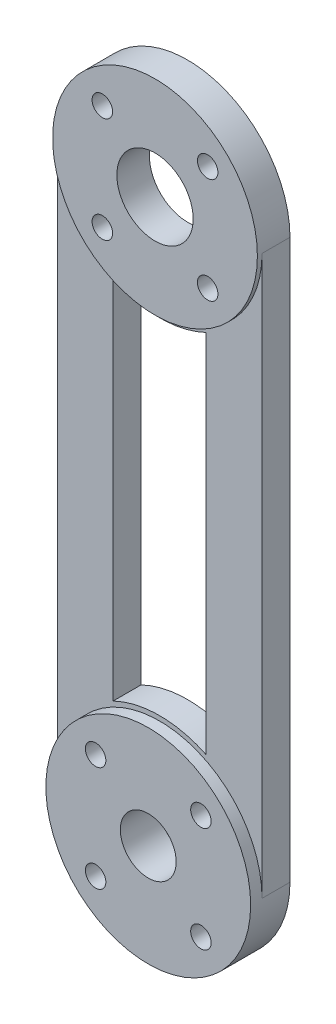
ISO-10303-21;
HEADER;
FILE_DESCRIPTION(('STEP AP214'),'2;1');
FILE_NAME('part.step','',(''),(''),'','','');
FILE_SCHEMA(('AUTOMOTIVE_DESIGN { 1 0 10303 214 1 1 1 1 }'));
ENDSEC;
DATA;
#1=APPLICATION_CONTEXT('core data for automotive mechanical design processes');
#2=APPLICATION_PROTOCOL_DEFINITION('international standard','automotive_design',2000,#1);
#3=PRODUCT_CONTEXT('',#1,'mechanical');
#4=PRODUCT('Part','Part','',(#3));
#5=PRODUCT_RELATED_PRODUCT_CATEGORY('part','',(#4));
#6=PRODUCT_DEFINITION_FORMATION('','',#4);
#7=PRODUCT_DEFINITION_CONTEXT('part definition',#1,'design');
#8=PRODUCT_DEFINITION('design','',#6,#7);
#9=PRODUCT_DEFINITION_SHAPE('','',#8);
#10=(LENGTH_UNIT() NAMED_UNIT(*) SI_UNIT(.MILLI.,.METRE.));
#11=(NAMED_UNIT(*) PLANE_ANGLE_UNIT() SI_UNIT($,.RADIAN.));
#12=(NAMED_UNIT(*) SI_UNIT($,.STERADIAN.) SOLID_ANGLE_UNIT());
#13=UNCERTAINTY_MEASURE_WITH_UNIT(LENGTH_MEASURE(1.E-05),#10,'distance_accuracy_value','');
#14=(GEOMETRIC_REPRESENTATION_CONTEXT(3) GLOBAL_UNCERTAINTY_ASSIGNED_CONTEXT((#13)) GLOBAL_UNIT_ASSIGNED_CONTEXT((#10,
#11,#12)) REPRESENTATION_CONTEXT('',''));
#15=CARTESIAN_POINT('',(0.,0.,0.));
#16=DIRECTION('',(0.,0.,1.));
#17=DIRECTION('',(1.,0.,0.));
#18=AXIS2_PLACEMENT_3D('',#15,#16,#17);
#19=CARTESIAN_POINT('',(-5.65685424949239,-35.6568542494924,9.71028137423857));
#20=DIRECTION('',(0.,0.,-1.));
#21=DIRECTION('',(1.,0.,0.));
#22=AXIS2_PLACEMENT_3D('',#19,#20,#21);
#23=CYLINDRICAL_SURFACE('',#22,1.1);
#24=CARTESIAN_POINT('',(-5.65685424949239,-35.6568542494924,1.225));
#25=DIRECTION('',(0.,0.,1.));
#26=DIRECTION('',(1.,0.,0.));
#27=AXIS2_PLACEMENT_3D('',#24,#25,#26);
#28=CIRCLE('',#27,1.1);
#29=CARTESIAN_POINT('',(-4.55685424949239,-35.6568542494924,1.225));
#30=VERTEX_POINT('',#29);
#31=EDGE_CURVE('E270',#30,#30,#28,.F.);
#32=ORIENTED_EDGE('',*,*,#31,.F.);
#33=EDGE_LOOP('',(#32));
#34=FACE_BOUND('',#33,.T.);
#35=CARTESIAN_POINT('',(-5.65685424949239,-35.6568542494924,-1.775));
#36=DIRECTION('',(0.,0.,1.));
#37=DIRECTION('',(1.,0.,0.));
#38=AXIS2_PLACEMENT_3D('',#35,#36,#37);
#39=CIRCLE('',#38,1.1);
#40=CARTESIAN_POINT('',(-4.55685424949239,-35.6568542494924,-1.775));
#41=VERTEX_POINT('',#40);
#42=EDGE_CURVE('E286',#41,#41,#39,.F.);
#43=ORIENTED_EDGE('',*,*,#42,.T.);
#44=EDGE_LOOP('',(#43));
#45=FACE_BOUND('',#44,.T.);
#46=ADVANCED_FACE('F37',(#34,#45),#23,.F.);
#47=CARTESIAN_POINT('',(-5.65685424949239,-24.3431457505076,9.71028137423857));
#48=DIRECTION('',(0.,0.,-1.));
#49=DIRECTION('',(1.,0.,0.));
#50=AXIS2_PLACEMENT_3D('',#47,#48,#49);
#51=CYLINDRICAL_SURFACE('',#50,1.1);
#52=CARTESIAN_POINT('',(-5.65685424949239,-24.3431457505076,1.225));
#53=DIRECTION('',(0.,0.,1.));
#54=DIRECTION('',(1.,0.,0.));
#55=AXIS2_PLACEMENT_3D('',#52,#53,#54);
#56=CIRCLE('',#55,1.1);
#57=CARTESIAN_POINT('',(-4.55685424949239,-24.3431457505076,1.225));
#58=VERTEX_POINT('',#57);
#59=EDGE_CURVE('E264',#58,#58,#56,.F.);
#60=ORIENTED_EDGE('',*,*,#59,.F.);
#61=EDGE_LOOP('',(#60));
#62=FACE_BOUND('',#61,.T.);
#63=CARTESIAN_POINT('',(-5.65685424949239,-24.3431457505076,-1.775));
#64=DIRECTION('',(0.,0.,1.));
#65=DIRECTION('',(1.,0.,0.));
#66=AXIS2_PLACEMENT_3D('',#63,#64,#65);
#67=CIRCLE('',#66,1.1);
#68=CARTESIAN_POINT('',(-4.55685424949239,-24.3431457505076,-1.775));
#69=VERTEX_POINT('',#68);
#70=EDGE_CURVE('E271',#69,#69,#67,.F.);
#71=ORIENTED_EDGE('',*,*,#70,.T.);
#72=EDGE_LOOP('',(#71));
#73=FACE_BOUND('',#72,.T.);
#74=ADVANCED_FACE('F354',(#62,#73),#51,.F.);
#75=CARTESIAN_POINT('',(5.65685424949243,-35.6568542494923,9.71028137423857));
#76=DIRECTION('',(0.,0.,-1.));
#77=DIRECTION('',(1.,0.,0.));
#78=AXIS2_PLACEMENT_3D('',#75,#76,#77);
#79=CYLINDRICAL_SURFACE('',#78,1.1);
#80=CARTESIAN_POINT('',(5.65685424949243,-35.6568542494923,1.225));
#81=DIRECTION('',(0.,0.,1.));
#82=DIRECTION('',(1.,0.,0.));
#83=AXIS2_PLACEMENT_3D('',#80,#81,#82);
#84=CIRCLE('',#83,1.1);
#85=CARTESIAN_POINT('',(6.75685424949243,-35.6568542494923,1.225));
#86=VERTEX_POINT('',#85);
#87=EDGE_CURVE('E267',#86,#86,#84,.F.);
#88=ORIENTED_EDGE('',*,*,#87,.F.);
#89=EDGE_LOOP('',(#88));
#90=FACE_BOUND('',#89,.T.);
#91=CARTESIAN_POINT('',(5.65685424949243,-35.6568542494923,-1.775));
#92=DIRECTION('',(0.,0.,1.));
#93=DIRECTION('',(1.,0.,0.));
#94=AXIS2_PLACEMENT_3D('',#91,#92,#93);
#95=CIRCLE('',#94,1.1);
#96=CARTESIAN_POINT('',(6.75685424949243,-35.6568542494923,-1.775));
#97=VERTEX_POINT('',#96);
#98=EDGE_CURVE('E276',#97,#97,#95,.F.);
#99=ORIENTED_EDGE('',*,*,#98,.T.);
#100=EDGE_LOOP('',(#99));
#101=FACE_BOUND('',#100,.T.);
#102=ADVANCED_FACE('F360',(#90,#101),#79,.F.);
#103=CARTESIAN_POINT('',(5.65685424949239,-24.3431457505076,9.71028137423857));
#104=DIRECTION('',(0.,0.,-1.));
#105=DIRECTION('',(1.,0.,0.));
#106=AXIS2_PLACEMENT_3D('',#103,#104,#105);
#107=CYLINDRICAL_SURFACE('',#106,1.1);
#108=CARTESIAN_POINT('',(5.65685424949239,-24.3431457505076,1.225));
#109=DIRECTION('',(0.,0.,1.));
#110=DIRECTION('',(1.,0.,0.));
#111=AXIS2_PLACEMENT_3D('',#108,#109,#110);
#112=CIRCLE('',#111,1.1);
#113=CARTESIAN_POINT('',(6.75685424949239,-24.3431457505076,1.225));
#114=VERTEX_POINT('',#113);
#115=EDGE_CURVE('E249',#114,#114,#112,.F.);
#116=ORIENTED_EDGE('',*,*,#115,.F.);
#117=EDGE_LOOP('',(#116));
#118=FACE_BOUND('',#117,.T.);
#119=CARTESIAN_POINT('',(5.65685424949239,-24.3431457505076,-1.775));
#120=DIRECTION('',(0.,0.,1.));
#121=DIRECTION('',(1.,0.,0.));
#122=AXIS2_PLACEMENT_3D('',#119,#120,#121);
#123=CIRCLE('',#122,1.1);
#124=CARTESIAN_POINT('',(6.75685424949239,-24.3431457505076,-1.775));
#125=VERTEX_POINT('',#124);
#126=EDGE_CURVE('E253',#125,#125,#123,.F.);
#127=ORIENTED_EDGE('',*,*,#126,.T.);
#128=EDGE_LOOP('',(#127));
#129=FACE_BOUND('',#128,.T.);
#130=ADVANCED_FACE('F371',(#118,#129),#107,.F.);
#131=CARTESIAN_POINT('',(-5.65685424949235,24.3431457505076,12.0965512114594));
#132=DIRECTION('',(0.,0.,-1.));
#133=DIRECTION('',(1.,0.,0.));
#134=AXIS2_PLACEMENT_3D('',#131,#132,#133);
#135=CYLINDRICAL_SURFACE('',#134,1.10000000000001);
#136=CARTESIAN_POINT('',(-5.65685424949235,24.3431457505076,0.5));
#137=DIRECTION('',(0.,0.,1.));
#138=DIRECTION('',(1.,0.,0.));
#139=AXIS2_PLACEMENT_3D('',#136,#137,#138);
#140=CIRCLE('',#139,1.10000000000001);
#141=CARTESIAN_POINT('',(-4.55685424949234,24.3431457505076,0.5));
#142=VERTEX_POINT('',#141);
#143=EDGE_CURVE('E215',#142,#142,#140,.F.);
#144=ORIENTED_EDGE('',*,*,#143,.F.);
#145=EDGE_LOOP('',(#144));
#146=FACE_BOUND('',#145,.T.);
#147=CARTESIAN_POINT('',(-5.65685424949235,24.3431457505076,-2.5));
#148=DIRECTION('',(0.,0.,1.));
#149=DIRECTION('',(1.,0.,0.));
#150=AXIS2_PLACEMENT_3D('',#147,#148,#149);
#151=CIRCLE('',#150,1.10000000000001);
#152=CARTESIAN_POINT('',(-4.55685424949234,24.3431457505076,-2.5));
#153=VERTEX_POINT('',#152);
#154=EDGE_CURVE('E224',#153,#153,#151,.F.);
#155=ORIENTED_EDGE('',*,*,#154,.T.);
#156=EDGE_LOOP('',(#155));
#157=FACE_BOUND('',#156,.T.);
#158=ADVANCED_FACE('F388',(#146,#157),#135,.F.);
#159=CARTESIAN_POINT('',(-5.65685424949243,35.6568542494923,12.0965512114594));
#160=DIRECTION('',(0.,0.,-1.));
#161=DIRECTION('',(1.,0.,0.));
#162=AXIS2_PLACEMENT_3D('',#159,#160,#161);
#163=CYLINDRICAL_SURFACE('',#162,1.10000000000001);
#164=CARTESIAN_POINT('',(-5.65685424949243,35.6568542494923,0.5));
#165=DIRECTION('',(0.,0.,1.));
#166=DIRECTION('',(1.,0.,0.));
#167=AXIS2_PLACEMENT_3D('',#164,#165,#166);
#168=CIRCLE('',#167,1.10000000000001);
#169=CARTESIAN_POINT('',(-4.55685424949242,35.6568542494923,0.5));
#170=VERTEX_POINT('',#169);
#171=EDGE_CURVE('E209',#170,#170,#168,.F.);
#172=ORIENTED_EDGE('',*,*,#171,.F.);
#173=EDGE_LOOP('',(#172));
#174=FACE_BOUND('',#173,.T.);
#175=CARTESIAN_POINT('',(-5.65685424949243,35.6568542494923,-2.5));
#176=DIRECTION('',(0.,0.,1.));
#177=DIRECTION('',(1.,0.,0.));
#178=AXIS2_PLACEMENT_3D('',#175,#176,#177);
#179=CIRCLE('',#178,1.10000000000001);
#180=CARTESIAN_POINT('',(-4.55685424949242,35.6568542494923,-2.5));
#181=VERTEX_POINT('',#180);
#182=EDGE_CURVE('E234',#181,#181,#179,.F.);
#183=ORIENTED_EDGE('',*,*,#182,.T.);
#184=EDGE_LOOP('',(#183));
#185=FACE_BOUND('',#184,.T.);
#186=ADVANCED_FACE('F419',(#174,#185),#163,.F.);
#187=CARTESIAN_POINT('',(5.65685424949247,24.3431457505077,12.0965512114594));
#188=DIRECTION('',(0.,0.,-1.));
#189=DIRECTION('',(1.,0.,0.));
#190=AXIS2_PLACEMENT_3D('',#187,#188,#189);
#191=CYLINDRICAL_SURFACE('',#190,1.10000000000001);
#192=CARTESIAN_POINT('',(5.65685424949247,24.3431457505077,0.5));
#193=DIRECTION('',(0.,0.,1.));
#194=DIRECTION('',(1.,0.,0.));
#195=AXIS2_PLACEMENT_3D('',#192,#193,#194);
#196=CIRCLE('',#195,1.10000000000001);
#197=CARTESIAN_POINT('',(6.75685424949248,24.3431457505077,0.5));
#198=VERTEX_POINT('',#197);
#199=EDGE_CURVE('E212',#198,#198,#196,.F.);
#200=ORIENTED_EDGE('',*,*,#199,.F.);
#201=EDGE_LOOP('',(#200));
#202=FACE_BOUND('',#201,.T.);
#203=CARTESIAN_POINT('',(5.65685424949247,24.3431457505077,-2.5));
#204=DIRECTION('',(0.,0.,1.));
#205=DIRECTION('',(1.,0.,0.));
#206=AXIS2_PLACEMENT_3D('',#203,#204,#205);
#207=CIRCLE('',#206,1.10000000000001);
#208=CARTESIAN_POINT('',(6.75685424949248,24.3431457505077,-2.5));
#209=VERTEX_POINT('',#208);
#210=EDGE_CURVE('E226',#209,#209,#207,.F.);
#211=ORIENTED_EDGE('',*,*,#210,.T.);
#212=EDGE_LOOP('',(#211));
#213=FACE_BOUND('',#212,.T.);
#214=ADVANCED_FACE('F423',(#202,#213),#191,.F.);
#215=CARTESIAN_POINT('',(5.65685424949234,35.6568542494924,12.0965512114594));
#216=DIRECTION('',(0.,0.,-1.));
#217=DIRECTION('',(1.,0.,0.));
#218=AXIS2_PLACEMENT_3D('',#215,#216,#217);
#219=CYLINDRICAL_SURFACE('',#218,1.10000000000001);
#220=CARTESIAN_POINT('',(5.65685424949234,35.6568542494924,0.5));
#221=DIRECTION('',(0.,0.,1.));
#222=DIRECTION('',(1.,0.,0.));
#223=AXIS2_PLACEMENT_3D('',#220,#221,#222);
#224=CIRCLE('',#223,1.10000000000001);
#225=CARTESIAN_POINT('',(6.75685424949235,35.6568542494924,0.5));
#226=VERTEX_POINT('',#225);
#227=EDGE_CURVE('E197',#226,#226,#224,.F.);
#228=ORIENTED_EDGE('',*,*,#227,.F.);
#229=EDGE_LOOP('',(#228));
#230=FACE_BOUND('',#229,.T.);
#231=CARTESIAN_POINT('',(5.65685424949234,35.6568542494924,-2.5));
#232=DIRECTION('',(0.,0.,1.));
#233=DIRECTION('',(1.,0.,0.));
#234=AXIS2_PLACEMENT_3D('',#231,#232,#233);
#235=CIRCLE('',#234,1.10000000000001);
#236=CARTESIAN_POINT('',(6.75685424949235,35.6568542494924,-2.5));
#237=VERTEX_POINT('',#236);
#238=EDGE_CURVE('E206',#237,#237,#235,.F.);
#239=ORIENTED_EDGE('',*,*,#238,.T.);
#240=EDGE_LOOP('',(#239));
#241=FACE_BOUND('',#240,.T.);
#242=ADVANCED_FACE('F426',(#230,#241),#219,.F.);
#243=CARTESIAN_POINT('',(0.,30.,-3.));
#244=DIRECTION('',(0.,0.,1.));
#245=DIRECTION('',(-1.,0.,0.));
#246=AXIS2_PLACEMENT_3D('',#243,#244,#245);
#247=CYLINDRICAL_SURFACE('',#246,11.5);
#248=CARTESIAN_POINT('',(0.,30.,0.));
#249=DIRECTION('',(0.,0.,1.));
#250=DIRECTION('',(1.,0.,0.));
#251=AXIS2_PLACEMENT_3D('',#248,#249,#250);
#252=CIRCLE('',#251,11.5);
#253=CARTESIAN_POINT('',(-5.,19.643842411396,0.));
#254=VERTEX_POINT('',#253);
#255=CARTESIAN_POINT('',(5.,19.643842411396,0.));
#256=VERTEX_POINT('',#255);
#257=EDGE_CURVE('E140',#254,#256,#252,.T.);
#258=ORIENTED_EDGE('',*,*,#257,.F.);
#259=DIRECTION('',(0.,0.,1.));
#260=VECTOR('',#259,1.);
#261=CARTESIAN_POINT('',(-5.,19.643842411396,-3.));
#262=LINE('',#261,#260);
#263=CARTESIAN_POINT('',(-5.,19.643842411396,-3.));
#264=VERTEX_POINT('',#263);
#265=EDGE_CURVE('E147',#264,#254,#262,.T.);
#266=ORIENTED_EDGE('',*,*,#265,.F.);
#267=CARTESIAN_POINT('',(0.,30.,-3.));
#268=DIRECTION('',(0.,0.,1.));
#269=DIRECTION('',(1.,0.,0.));
#270=AXIS2_PLACEMENT_3D('',#267,#268,#269);
#271=CIRCLE('',#270,11.5);
#272=CARTESIAN_POINT('',(5.,19.643842411396,-3.));
#273=VERTEX_POINT('',#272);
#274=EDGE_CURVE('E125',#264,#273,#271,.T.);
#275=ORIENTED_EDGE('',*,*,#274,.T.);
#276=DIRECTION('',(0.,0.,1.));
#277=VECTOR('',#276,1.);
#278=CARTESIAN_POINT('',(5.,19.643842411396,-3.));
#279=LINE('',#278,#277);
#280=EDGE_CURVE('E47',#273,#256,#279,.T.);
#281=ORIENTED_EDGE('',*,*,#280,.T.);
#282=EDGE_LOOP('',(#258,#266,#275,#281));
#283=FACE_BOUND('',#282,.T.);
#284=ADVANCED_FACE('F437',(#283),#247,.T.);
#285=CARTESIAN_POINT('',(5.,0.,-3.));
#286=DIRECTION('',(1.,0.,0.));
#287=DIRECTION('',(0.,1.,0.));
#288=AXIS2_PLACEMENT_3D('',#285,#286,#287);
#289=PLANE('',#288);
#290=DIRECTION('',(0.,-1.,0.));
#291=VECTOR('',#290,1.);
#292=CARTESIAN_POINT('',(5.,0.,0.));
#293=LINE('',#292,#291);
#294=CARTESIAN_POINT('',(5.,-19.643842411396,0.));
#295=VERTEX_POINT('',#294);
#296=EDGE_CURVE('E142',#256,#295,#293,.T.);
#297=ORIENTED_EDGE('',*,*,#296,.F.);
#298=ORIENTED_EDGE('',*,*,#280,.F.);
#299=DIRECTION('',(0.,-1.,0.));
#300=VECTOR('',#299,1.);
#301=CARTESIAN_POINT('',(5.,0.,-3.));
#302=LINE('',#301,#300);
#303=CARTESIAN_POINT('',(5.,-19.643842411396,-3.));
#304=VERTEX_POINT('',#303);
#305=EDGE_CURVE('E110',#273,#304,#302,.T.);
#306=ORIENTED_EDGE('',*,*,#305,.T.);
#307=DIRECTION('',(0.,0.,1.));
#308=VECTOR('',#307,1.);
#309=CARTESIAN_POINT('',(5.,-19.643842411396,-3.));
#310=LINE('',#309,#308);
#311=EDGE_CURVE('E115',#304,#295,#310,.T.);
#312=ORIENTED_EDGE('',*,*,#311,.T.);
#313=EDGE_LOOP('',(#297,#298,#306,#312));
#314=FACE_BOUND('',#313,.T.);
#315=ADVANCED_FACE('F122',(#314),#289,.F.);
#316=CARTESIAN_POINT('',(0.,-30.,-3.));
#317=DIRECTION('',(0.,0.,1.));
#318=DIRECTION('',(-1.,0.,0.));
#319=AXIS2_PLACEMENT_3D('',#316,#317,#318);
#320=CYLINDRICAL_SURFACE('',#319,11.5);
#321=CARTESIAN_POINT('',(0.,-30.,0.));
#322=DIRECTION('',(0.,0.,1.));
#323=DIRECTION('',(1.,0.,0.));
#324=AXIS2_PLACEMENT_3D('',#321,#322,#323);
#325=CIRCLE('',#324,11.5);
#326=CARTESIAN_POINT('',(-4.99999999999999,-19.643842411396,0.));
#327=VERTEX_POINT('',#326);
#328=EDGE_CURVE('E117',#295,#327,#325,.T.);
#329=ORIENTED_EDGE('',*,*,#328,.F.);
#330=ORIENTED_EDGE('',*,*,#311,.F.);
#331=CARTESIAN_POINT('',(0.,-30.,-3.));
#332=DIRECTION('',(0.,0.,1.));
#333=DIRECTION('',(1.,0.,0.));
#334=AXIS2_PLACEMENT_3D('',#331,#332,#333);
#335=CIRCLE('',#334,11.5);
#336=CARTESIAN_POINT('',(-4.99999999999999,-19.643842411396,-3.));
#337=VERTEX_POINT('',#336);
#338=EDGE_CURVE('E106',#304,#337,#335,.T.);
#339=ORIENTED_EDGE('',*,*,#338,.T.);
#340=DIRECTION('',(0.,0.,1.));
#341=VECTOR('',#340,1.);
#342=CARTESIAN_POINT('',(-4.99999999999999,-19.643842411396,-3.));
#343=LINE('',#342,#341);
#344=EDGE_CURVE('E120',#337,#327,#343,.T.);
#345=ORIENTED_EDGE('',*,*,#344,.T.);
#346=EDGE_LOOP('',(#329,#330,#339,#345));
#347=FACE_BOUND('',#346,.T.);
#348=ADVANCED_FACE('F116',(#347),#320,.T.);
#349=CARTESIAN_POINT('',(11.,0.,-3.));
#350=DIRECTION('',(1.,0.,0.));
#351=DIRECTION('',(0.,1.,0.));
#352=AXIS2_PLACEMENT_3D('',#349,#350,#351);
#353=PLANE('',#352);
#354=DIRECTION('',(0.,-1.,0.));
#355=VECTOR('',#354,1.);
#356=CARTESIAN_POINT('',(11.,0.,0.));
#357=LINE('',#356,#355);
#358=CARTESIAN_POINT('',(11.,30.,0.));
#359=VERTEX_POINT('',#358);
#360=CARTESIAN_POINT('',(11.,-30.,0.));
#361=VERTEX_POINT('',#360);
#362=EDGE_CURVE('E133',#359,#361,#357,.T.);
#363=ORIENTED_EDGE('',*,*,#362,.T.);
#364=DIRECTION('',(0.,0.,1.));
#365=VECTOR('',#364,1.);
#366=CARTESIAN_POINT('',(11.,-30.,-3.));
#367=LINE('',#366,#365);
#368=CARTESIAN_POINT('',(11.,-30.,-3.));
#369=VERTEX_POINT('',#368);
#370=EDGE_CURVE('E132',#369,#361,#367,.T.);
#371=ORIENTED_EDGE('',*,*,#370,.F.);
#372=DIRECTION('',(0.,-1.,0.));
#373=VECTOR('',#372,1.);
#374=CARTESIAN_POINT('',(11.,0.,-3.));
#375=LINE('',#374,#373);
#376=CARTESIAN_POINT('',(11.,30.,-3.));
#377=VERTEX_POINT('',#376);
#378=EDGE_CURVE('E146',#377,#369,#375,.T.);
#379=ORIENTED_EDGE('',*,*,#378,.F.);
#380=DIRECTION('',(0.,0.,1.));
#381=VECTOR('',#380,1.);
#382=CARTESIAN_POINT('',(11.,30.,-3.));
#383=LINE('',#382,#381);
#384=EDGE_CURVE('E41',#377,#359,#383,.T.);
#385=ORIENTED_EDGE('',*,*,#384,.T.);
#386=EDGE_LOOP('',(#363,#371,#379,#385));
#387=FACE_BOUND('',#386,.T.);
#388=ADVANCED_FACE('F39',(#387),#353,.T.);
#389=CARTESIAN_POINT('',(0.,30.,-3.));
#390=DIRECTION('',(0.,0.,1.));
#391=DIRECTION('',(-1.,0.,0.));
#392=AXIS2_PLACEMENT_3D('',#389,#390,#391);
#393=CYLINDRICAL_SURFACE('',#392,11.);
#394=ORIENTED_EDGE('',*,*,#384,.F.);
#395=CARTESIAN_POINT('',(0.,30.,-3.));
#396=DIRECTION('',(0.,0.,1.));
#397=DIRECTION('',(1.,0.,0.));
#398=AXIS2_PLACEMENT_3D('',#395,#396,#397);
#399=CIRCLE('',#398,11.);
#400=CARTESIAN_POINT('',(-11.,30.,-3.));
#401=VERTEX_POINT('',#400);
#402=EDGE_CURVE('E89',#377,#401,#399,.T.);
#403=ORIENTED_EDGE('',*,*,#402,.T.);
#404=DIRECTION('',(0.,0.,1.));
#405=VECTOR('',#404,1.);
#406=CARTESIAN_POINT('',(-11.,30.,-3.));
#407=LINE('',#406,#405);
#408=CARTESIAN_POINT('',(-11.,30.,0.));
#409=VERTEX_POINT('',#408);
#410=EDGE_CURVE('E155',#401,#409,#407,.T.);
#411=ORIENTED_EDGE('',*,*,#410,.T.);
#412=CARTESIAN_POINT('',(0.,30.,0.));
#413=DIRECTION('',(0.,0.,1.));
#414=DIRECTION('',(1.,0.,0.));
#415=AXIS2_PLACEMENT_3D('',#412,#413,#414);
#416=CIRCLE('',#415,11.);
#417=EDGE_CURVE('E12',#409,#359,#416,.T.);
#418=ORIENTED_EDGE('',*,*,#417,.T.);
#419=EDGE_LOOP('',(#394,#403,#411,#418));
#420=FACE_BOUND('',#419,.T.);
#421=CARTESIAN_POINT('',(0.,30.,0.5));
#422=DIRECTION('',(0.,0.,1.));
#423=DIRECTION('',(1.,0.,0.));
#424=AXIS2_PLACEMENT_3D('',#421,#422,#423);
#425=CIRCLE('',#424,11.);
#426=CARTESIAN_POINT('',(11.,30.,0.5));
#427=VERTEX_POINT('',#426);
#428=EDGE_CURVE('E137',#427,#427,#425,.T.);
#429=ORIENTED_EDGE('',*,*,#428,.F.);
#430=EDGE_LOOP('',(#429));
#431=FACE_BOUND('',#430,.T.);
#432=ADVANCED_FACE('F186',(#420,#431),#393,.T.);
#433=CARTESIAN_POINT('',(-11.,0.,-3.));
#434=DIRECTION('',(1.,0.,0.));
#435=DIRECTION('',(0.,1.,0.));
#436=AXIS2_PLACEMENT_3D('',#433,#434,#435);
#437=PLANE('',#436);
#438=DIRECTION('',(0.,-1.,0.));
#439=VECTOR('',#438,1.);
#440=CARTESIAN_POINT('',(-11.,0.,0.));
#441=LINE('',#440,#439);
#442=CARTESIAN_POINT('',(-11.,-30.,0.));
#443=VERTEX_POINT('',#442);
#444=EDGE_CURVE('E136',#409,#443,#441,.T.);
#445=ORIENTED_EDGE('',*,*,#444,.F.);
#446=ORIENTED_EDGE('',*,*,#410,.F.);
#447=DIRECTION('',(0.,-1.,0.));
#448=VECTOR('',#447,1.);
#449=CARTESIAN_POINT('',(-11.,0.,-3.));
#450=LINE('',#449,#448);
#451=CARTESIAN_POINT('',(-11.,-30.,-3.));
#452=VERTEX_POINT('',#451);
#453=EDGE_CURVE('E179',#401,#452,#450,.T.);
#454=ORIENTED_EDGE('',*,*,#453,.T.);
#455=DIRECTION('',(0.,0.,1.));
#456=VECTOR('',#455,1.);
#457=CARTESIAN_POINT('',(-11.,-30.,-3.));
#458=LINE('',#457,#456);
#459=EDGE_CURVE('E153',#452,#443,#458,.T.);
#460=ORIENTED_EDGE('',*,*,#459,.T.);
#461=EDGE_LOOP('',(#445,#446,#454,#460));
#462=FACE_BOUND('',#461,.T.);
#463=ADVANCED_FACE('F185',(#462),#437,.F.);
#464=CARTESIAN_POINT('',(0.,-30.,-3.));
#465=DIRECTION('',(0.,0.,1.));
#466=DIRECTION('',(-1.,0.,0.));
#467=AXIS2_PLACEMENT_3D('',#464,#465,#466);
#468=CYLINDRICAL_SURFACE('',#467,11.);
#469=ORIENTED_EDGE('',*,*,#459,.F.);
#470=CARTESIAN_POINT('',(0.,-30.,-3.));
#471=DIRECTION('',(0.,0.,1.));
#472=DIRECTION('',(1.,0.,0.));
#473=AXIS2_PLACEMENT_3D('',#470,#471,#472);
#474=CIRCLE('',#473,11.);
#475=EDGE_CURVE('E127',#452,#369,#474,.T.);
#476=ORIENTED_EDGE('',*,*,#475,.T.);
#477=ORIENTED_EDGE('',*,*,#370,.T.);
#478=CARTESIAN_POINT('',(0.,-30.,0.));
#479=DIRECTION('',(0.,0.,1.));
#480=DIRECTION('',(1.,0.,0.));
#481=AXIS2_PLACEMENT_3D('',#478,#479,#480);
#482=CIRCLE('',#481,11.);
#483=EDGE_CURVE('E168',#361,#443,#482,.T.);
#484=ORIENTED_EDGE('',*,*,#483,.T.);
#485=EDGE_LOOP('',(#469,#476,#477,#484));
#486=FACE_BOUND('',#485,.T.);
#487=CARTESIAN_POINT('',(0.,-30.,1.225));
#488=DIRECTION('',(0.,0.,1.));
#489=DIRECTION('',(1.,0.,0.));
#490=AXIS2_PLACEMENT_3D('',#487,#488,#489);
#491=CIRCLE('',#490,11.);
#492=CARTESIAN_POINT('',(11.,-30.,1.225));
#493=VERTEX_POINT('',#492);
#494=EDGE_CURVE('E173',#493,#493,#491,.T.);
#495=ORIENTED_EDGE('',*,*,#494,.F.);
#496=EDGE_LOOP('',(#495));
#497=FACE_BOUND('',#496,.T.);
#498=ADVANCED_FACE('F176',(#486,#497),#468,.T.);
#499=CARTESIAN_POINT('',(-5.,0.,-3.));
#500=DIRECTION('',(1.,0.,0.));
#501=DIRECTION('',(0.,1.,0.));
#502=AXIS2_PLACEMENT_3D('',#499,#500,#501);
#503=PLANE('',#502);
#504=DIRECTION('',(0.,-1.,0.));
#505=VECTOR('',#504,1.);
#506=CARTESIAN_POINT('',(-5.,0.,0.));
#507=LINE('',#506,#505);
#508=EDGE_CURVE('E76',#254,#327,#507,.T.);
#509=ORIENTED_EDGE('',*,*,#508,.T.);
#510=ORIENTED_EDGE('',*,*,#344,.F.);
#511=DIRECTION('',(0.,-1.,0.));
#512=VECTOR('',#511,1.);
#513=CARTESIAN_POINT('',(-5.,0.,-3.));
#514=LINE('',#513,#512);
#515=EDGE_CURVE('E56',#264,#337,#514,.T.);
#516=ORIENTED_EDGE('',*,*,#515,.F.);
#517=ORIENTED_EDGE('',*,*,#265,.T.);
#518=EDGE_LOOP('',(#509,#510,#516,#517));
#519=FACE_BOUND('',#518,.T.);
#520=ADVANCED_FACE('F315',(#519),#503,.T.);
#521=CARTESIAN_POINT('',(0.,0.,-3.));
#522=DIRECTION('',(0.,0.,-1.));
#523=DIRECTION('',(1.,0.,0.));
#524=AXIS2_PLACEMENT_3D('',#521,#522,#523);
#525=PLANE('',#524);
#526=CARTESIAN_POINT('',(-5.65685424949239,-24.3431457505076,-3.));
#527=DIRECTION('',(0.,0.,1.));
#528=DIRECTION('',(0.,1.,0.));
#529=AXIS2_PLACEMENT_3D('',#526,#527,#528);
#530=CIRCLE('',#529,2.);
#531=CARTESIAN_POINT('',(-5.65685424949239,-22.3431457505076,-3.));
#532=VERTEX_POINT('',#531);
#533=EDGE_CURVE('E289',#532,#532,#530,.T.);
#534=ORIENTED_EDGE('',*,*,#533,.T.);
#535=EDGE_LOOP('',(#534));
#536=FACE_BOUND('',#535,.T.);
#537=CARTESIAN_POINT('',(-5.65685424949239,-35.6568542494924,-3.));
#538=DIRECTION('',(0.,0.,1.));
#539=DIRECTION('',(-1.,0.,0.));
#540=AXIS2_PLACEMENT_3D('',#537,#538,#539);
#541=CIRCLE('',#540,2.);
#542=CARTESIAN_POINT('',(-7.65685424949239,-35.6568542494924,-3.));
#543=VERTEX_POINT('',#542);
#544=EDGE_CURVE('E279',#543,#543,#541,.T.);
#545=ORIENTED_EDGE('',*,*,#544,.T.);
#546=EDGE_LOOP('',(#545));
#547=FACE_BOUND('',#546,.T.);
#548=CARTESIAN_POINT('',(5.65685424949243,-35.6568542494923,-3.));
#549=DIRECTION('',(0.,0.,1.));
#550=DIRECTION('',(0.,-1.,0.));
#551=AXIS2_PLACEMENT_3D('',#548,#549,#550);
#552=CIRCLE('',#551,2.);
#553=CARTESIAN_POINT('',(5.65685424949245,-37.6568542494923,-3.));
#554=VERTEX_POINT('',#553);
#555=EDGE_CURVE('E281',#554,#554,#552,.T.);
#556=ORIENTED_EDGE('',*,*,#555,.T.);
#557=EDGE_LOOP('',(#556));
#558=FACE_BOUND('',#557,.T.);
#559=CARTESIAN_POINT('',(5.65685424949239,-24.3431457505076,-3.));
#560=DIRECTION('',(0.,0.,1.));
#561=DIRECTION('',(1.,0.,0.));
#562=AXIS2_PLACEMENT_3D('',#559,#560,#561);
#563=CIRCLE('',#562,2.);
#564=CARTESIAN_POINT('',(7.65685424949239,-24.3431457505076,-3.));
#565=VERTEX_POINT('',#564);
#566=EDGE_CURVE('E261',#565,#565,#563,.T.);
#567=ORIENTED_EDGE('',*,*,#566,.T.);
#568=EDGE_LOOP('',(#567));
#569=FACE_BOUND('',#568,.T.);
#570=CARTESIAN_POINT('',(0.,-30.,-3.));
#571=DIRECTION('',(0.,0.,1.));
#572=DIRECTION('',(1.,0.,0.));
#573=AXIS2_PLACEMENT_3D('',#570,#571,#572);
#574=CIRCLE('',#573,3.);
#575=CARTESIAN_POINT('',(3.,-30.,-3.));
#576=VERTEX_POINT('',#575);
#577=EDGE_CURVE('E252',#576,#576,#574,.T.);
#578=ORIENTED_EDGE('',*,*,#577,.T.);
#579=EDGE_LOOP('',(#578));
#580=FACE_BOUND('',#579,.T.);
#581=CARTESIAN_POINT('',(-5.65685424949243,35.6568542494923,-3.));
#582=DIRECTION('',(0.,0.,1.));
#583=DIRECTION('',(0.,1.,0.));
#584=AXIS2_PLACEMENT_3D('',#581,#582,#583);
#585=CIRCLE('',#584,2.00000000000001);
#586=CARTESIAN_POINT('',(-5.65685424949244,37.6568542494923,-3.));
#587=VERTEX_POINT('',#586);
#588=EDGE_CURVE('E242',#587,#587,#585,.T.);
#589=ORIENTED_EDGE('',*,*,#588,.T.);
#590=EDGE_LOOP('',(#589));
#591=FACE_BOUND('',#590,.T.);
#592=CARTESIAN_POINT('',(-5.65685424949235,24.3431457505076,-3.));
#593=DIRECTION('',(0.,0.,1.));
#594=DIRECTION('',(-1.,0.,0.));
#595=AXIS2_PLACEMENT_3D('',#592,#593,#594);
#596=CIRCLE('',#595,2.00000000000001);
#597=CARTESIAN_POINT('',(-7.65685424949236,24.3431457505076,-3.));
#598=VERTEX_POINT('',#597);
#599=EDGE_CURVE('E235',#598,#598,#596,.T.);
#600=ORIENTED_EDGE('',*,*,#599,.T.);
#601=EDGE_LOOP('',(#600));
#602=FACE_BOUND('',#601,.T.);
#603=CARTESIAN_POINT('',(5.65685424949247,24.3431457505077,-3.));
#604=DIRECTION('',(0.,0.,1.));
#605=DIRECTION('',(0.,-1.,0.));
#606=AXIS2_PLACEMENT_3D('',#603,#604,#605);
#607=CIRCLE('',#606,2.00000000000001);
#608=CARTESIAN_POINT('',(5.65685424949249,22.3431457505077,-3.));
#609=VERTEX_POINT('',#608);
#610=EDGE_CURVE('E225',#609,#609,#607,.T.);
#611=ORIENTED_EDGE('',*,*,#610,.T.);
#612=EDGE_LOOP('',(#611));
#613=FACE_BOUND('',#612,.T.);
#614=CARTESIAN_POINT('',(5.65685424949234,35.6568542494924,-3.));
#615=DIRECTION('',(0.,0.,1.));
#616=DIRECTION('',(1.,0.,0.));
#617=AXIS2_PLACEMENT_3D('',#614,#615,#616);
#618=CIRCLE('',#617,2.00000000000001);
#619=CARTESIAN_POINT('',(7.65685424949235,35.6568542494924,-3.));
#620=VERTEX_POINT('',#619);
#621=EDGE_CURVE('E205',#620,#620,#618,.T.);
#622=ORIENTED_EDGE('',*,*,#621,.T.);
#623=EDGE_LOOP('',(#622));
#624=FACE_BOUND('',#623,.T.);
#625=CARTESIAN_POINT('',(0.,30.,-3.));
#626=DIRECTION('',(0.,0.,1.));
#627=DIRECTION('',(1.,0.,0.));
#628=AXIS2_PLACEMENT_3D('',#625,#626,#627);
#629=CIRCLE('',#628,4.1);
#630=CARTESIAN_POINT('',(4.1,30.,-3.));
#631=VERTEX_POINT('',#630);
#632=EDGE_CURVE('E194',#631,#631,#629,.T.);
#633=ORIENTED_EDGE('',*,*,#632,.T.);
#634=EDGE_LOOP('',(#633));
#635=FACE_BOUND('',#634,.T.);
#636=ORIENTED_EDGE('',*,*,#378,.T.);
#637=ORIENTED_EDGE('',*,*,#475,.F.);
#638=ORIENTED_EDGE('',*,*,#453,.F.);
#639=ORIENTED_EDGE('',*,*,#402,.F.);
#640=EDGE_LOOP('',(#636,#637,#638,#639));
#641=FACE_BOUND('',#640,.T.);
#642=ORIENTED_EDGE('',*,*,#274,.F.);
#643=ORIENTED_EDGE('',*,*,#515,.T.);
#644=ORIENTED_EDGE('',*,*,#338,.F.);
#645=ORIENTED_EDGE('',*,*,#305,.F.);
#646=EDGE_LOOP('',(#642,#643,#644,#645));
#647=FACE_BOUND('',#646,.T.);
#648=ADVANCED_FACE('F108',(#536,#547,#558,#569,#580,#591,#602,#613,#624,#635,#641,#647),#525,.T.);
#649=CARTESIAN_POINT('',(0.,0.,0.));
#650=DIRECTION('',(0.,0.,-1.));
#651=DIRECTION('',(1.,0.,0.));
#652=AXIS2_PLACEMENT_3D('',#649,#650,#651);
#653=PLANE('',#652);
#654=ORIENTED_EDGE('',*,*,#362,.F.);
#655=ORIENTED_EDGE('',*,*,#417,.F.);
#656=ORIENTED_EDGE('',*,*,#444,.T.);
#657=ORIENTED_EDGE('',*,*,#483,.F.);
#658=EDGE_LOOP('',(#654,#655,#656,#657));
#659=FACE_BOUND('',#658,.T.);
#660=ORIENTED_EDGE('',*,*,#257,.T.);
#661=ORIENTED_EDGE('',*,*,#296,.T.);
#662=ORIENTED_EDGE('',*,*,#328,.T.);
#663=ORIENTED_EDGE('',*,*,#508,.F.);
#664=EDGE_LOOP('',(#660,#661,#662,#663));
#665=FACE_BOUND('',#664,.T.);
#666=ADVANCED_FACE('F166',(#659,#665),#653,.F.);
#667=CARTESIAN_POINT('',(0.,0.,0.5));
#668=DIRECTION('',(0.,0.,-1.));
#669=DIRECTION('',(1.,0.,0.));
#670=AXIS2_PLACEMENT_3D('',#667,#668,#669);
#671=PLANE('',#670);
#672=ORIENTED_EDGE('',*,*,#199,.T.);
#673=EDGE_LOOP('',(#672));
#674=FACE_BOUND('',#673,.T.);
#675=ORIENTED_EDGE('',*,*,#171,.T.);
#676=EDGE_LOOP('',(#675));
#677=FACE_BOUND('',#676,.T.);
#678=ORIENTED_EDGE('',*,*,#143,.T.);
#679=EDGE_LOOP('',(#678));
#680=FACE_BOUND('',#679,.T.);
#681=CARTESIAN_POINT('',(0.,30.,0.5));
#682=DIRECTION('',(0.,0.,1.));
#683=DIRECTION('',(1.,0.,0.));
#684=AXIS2_PLACEMENT_3D('',#681,#682,#683);
#685=CIRCLE('',#684,4.1);
#686=CARTESIAN_POINT('',(4.1,30.,0.5));
#687=VERTEX_POINT('',#686);
#688=EDGE_CURVE('E192',#687,#687,#685,.F.);
#689=ORIENTED_EDGE('',*,*,#688,.T.);
#690=EDGE_LOOP('',(#689));
#691=FACE_BOUND('',#690,.T.);
#692=ORIENTED_EDGE('',*,*,#227,.T.);
#693=EDGE_LOOP('',(#692));
#694=FACE_BOUND('',#693,.T.);
#695=ORIENTED_EDGE('',*,*,#428,.T.);
#696=EDGE_LOOP('',(#695));
#697=FACE_BOUND('',#696,.T.);
#698=ADVANCED_FACE('F338',(#674,#677,#680,#691,#694,#697),#671,.F.);
#699=CARTESIAN_POINT('',(0.,30.,12.0965512114594));
#700=DIRECTION('',(0.,0.,-1.));
#701=DIRECTION('',(1.,0.,0.));
#702=AXIS2_PLACEMENT_3D('',#699,#700,#701);
#703=CYLINDRICAL_SURFACE('',#702,4.1);
#704=ORIENTED_EDGE('',*,*,#688,.F.);
#705=EDGE_LOOP('',(#704));
#706=FACE_BOUND('',#705,.T.);
#707=ORIENTED_EDGE('',*,*,#632,.F.);
#708=EDGE_LOOP('',(#707));
#709=FACE_BOUND('',#708,.T.);
#710=ADVANCED_FACE('F335',(#706,#709),#703,.F.);
#711=CARTESIAN_POINT('',(5.65685424949234,35.6568542494924,6.1568542494924));
#712=DIRECTION('',(0.,0.,-1.));
#713=DIRECTION('',(1.,0.,0.));
#714=AXIS2_PLACEMENT_3D('',#711,#712,#713);
#715=CYLINDRICAL_SURFACE('',#714,2.00000000000001);
#716=CARTESIAN_POINT('',(5.65685424949234,35.6568542494924,-2.5));
#717=DIRECTION('',(0.,0.,1.));
#718=DIRECTION('',(1.,0.,0.));
#719=AXIS2_PLACEMENT_3D('',#716,#717,#718);
#720=CIRCLE('',#719,2.00000000000001);
#721=CARTESIAN_POINT('',(7.65685424949235,35.6568542494924,-2.5));
#722=VERTEX_POINT('',#721);
#723=EDGE_CURVE('E199',#722,#722,#720,.F.);
#724=ORIENTED_EDGE('',*,*,#723,.F.);
#725=EDGE_LOOP('',(#724));
#726=FACE_BOUND('',#725,.T.);
#727=ORIENTED_EDGE('',*,*,#621,.F.);
#728=EDGE_LOOP('',(#727));
#729=FACE_BOUND('',#728,.T.);
#730=ADVANCED_FACE('F337',(#726,#729),#715,.F.);
#731=CARTESIAN_POINT('',(0.,0.,-2.5));
#732=DIRECTION('',(0.,0.,-1.));
#733=DIRECTION('',(1.,0.,0.));
#734=AXIS2_PLACEMENT_3D('',#731,#732,#733);
#735=PLANE('',#734);
#736=ORIENTED_EDGE('',*,*,#723,.T.);
#737=EDGE_LOOP('',(#736));
#738=FACE_BOUND('',#737,.T.);
#739=ORIENTED_EDGE('',*,*,#238,.F.);
#740=EDGE_LOOP('',(#739));
#741=FACE_BOUND('',#740,.T.);
#742=ADVANCED_FACE('F345',(#738,#741),#735,.T.);
#743=CARTESIAN_POINT('',(5.65685424949247,24.3431457505077,6.1568542494924));
#744=DIRECTION('',(0.,0.,-1.));
#745=DIRECTION('',(1.,0.,0.));
#746=AXIS2_PLACEMENT_3D('',#743,#744,#745);
#747=CYLINDRICAL_SURFACE('',#746,2.00000000000001);
#748=CARTESIAN_POINT('',(5.65685424949247,24.3431457505077,-2.5));
#749=DIRECTION('',(0.,0.,1.));
#750=DIRECTION('',(1.,0.,0.));
#751=AXIS2_PLACEMENT_3D('',#748,#749,#750);
#752=CIRCLE('',#751,2.00000000000001);
#753=CARTESIAN_POINT('',(7.65685424949247,24.3431457505077,-2.5));
#754=VERTEX_POINT('',#753);
#755=EDGE_CURVE('E221',#754,#754,#752,.F.);
#756=ORIENTED_EDGE('',*,*,#755,.F.);
#757=EDGE_LOOP('',(#756));
#758=FACE_BOUND('',#757,.T.);
#759=ORIENTED_EDGE('',*,*,#610,.F.);
#760=EDGE_LOOP('',(#759));
#761=FACE_BOUND('',#760,.T.);
#762=ADVANCED_FACE('F410',(#758,#761),#747,.F.);
#763=CARTESIAN_POINT('',(0.,0.,-2.5));
#764=DIRECTION('',(0.,0.,-1.));
#765=DIRECTION('',(1.,0.,0.));
#766=AXIS2_PLACEMENT_3D('',#763,#764,#765);
#767=PLANE('',#766);
#768=ORIENTED_EDGE('',*,*,#755,.T.);
#769=EDGE_LOOP('',(#768));
#770=FACE_BOUND('',#769,.T.);
#771=ORIENTED_EDGE('',*,*,#210,.F.);
#772=EDGE_LOOP('',(#771));
#773=FACE_BOUND('',#772,.T.);
#774=ADVANCED_FACE('F398',(#770,#773),#767,.T.);
#775=CARTESIAN_POINT('',(-5.65685424949243,35.6568542494923,6.1568542494924));
#776=DIRECTION('',(0.,0.,-1.));
#777=DIRECTION('',(1.,0.,0.));
#778=AXIS2_PLACEMENT_3D('',#775,#776,#777);
#779=CYLINDRICAL_SURFACE('',#778,2.00000000000001);
#780=CARTESIAN_POINT('',(-5.65685424949243,35.6568542494923,-2.5));
#781=DIRECTION('',(0.,0.,1.));
#782=DIRECTION('',(1.,0.,0.));
#783=AXIS2_PLACEMENT_3D('',#780,#781,#782);
#784=CIRCLE('',#783,2.00000000000001);
#785=CARTESIAN_POINT('',(-3.65685424949243,35.6568542494923,-2.5));
#786=VERTEX_POINT('',#785);
#787=EDGE_CURVE('E216',#786,#786,#784,.F.);
#788=ORIENTED_EDGE('',*,*,#787,.F.);
#789=EDGE_LOOP('',(#788));
#790=FACE_BOUND('',#789,.T.);
#791=ORIENTED_EDGE('',*,*,#588,.F.);
#792=EDGE_LOOP('',(#791));
#793=FACE_BOUND('',#792,.T.);
#794=ADVANCED_FACE('F394',(#790,#793),#779,.F.);
#795=CARTESIAN_POINT('',(0.,0.,-2.5));
#796=DIRECTION('',(0.,0.,-1.));
#797=DIRECTION('',(1.,0.,0.));
#798=AXIS2_PLACEMENT_3D('',#795,#796,#797);
#799=PLANE('',#798);
#800=ORIENTED_EDGE('',*,*,#787,.T.);
#801=EDGE_LOOP('',(#800));
#802=FACE_BOUND('',#801,.T.);
#803=ORIENTED_EDGE('',*,*,#182,.F.);
#804=EDGE_LOOP('',(#803));
#805=FACE_BOUND('',#804,.T.);
#806=ADVANCED_FACE('F397',(#802,#805),#799,.T.);
#807=CARTESIAN_POINT('',(-5.65685424949235,24.3431457505076,6.1568542494924));
#808=DIRECTION('',(0.,0.,-1.));
#809=DIRECTION('',(1.,0.,0.));
#810=AXIS2_PLACEMENT_3D('',#807,#808,#809);
#811=CYLINDRICAL_SURFACE('',#810,2.00000000000001);
#812=CARTESIAN_POINT('',(-5.65685424949235,24.3431457505076,-2.5));
#813=DIRECTION('',(0.,0.,1.));
#814=DIRECTION('',(1.,0.,0.));
#815=AXIS2_PLACEMENT_3D('',#812,#813,#814);
#816=CIRCLE('',#815,2.00000000000001);
#817=CARTESIAN_POINT('',(-3.65685424949234,24.3431457505076,-2.5));
#818=VERTEX_POINT('',#817);
#819=EDGE_CURVE('E231',#818,#818,#816,.F.);
#820=ORIENTED_EDGE('',*,*,#819,.F.);
#821=EDGE_LOOP('',(#820));
#822=FACE_BOUND('',#821,.T.);
#823=ORIENTED_EDGE('',*,*,#599,.F.);
#824=EDGE_LOOP('',(#823));
#825=FACE_BOUND('',#824,.T.);
#826=ADVANCED_FACE('F402',(#822,#825),#811,.F.);
#827=CARTESIAN_POINT('',(0.,0.,-2.5));
#828=DIRECTION('',(0.,0.,-1.));
#829=DIRECTION('',(1.,0.,0.));
#830=AXIS2_PLACEMENT_3D('',#827,#828,#829);
#831=PLANE('',#830);
#832=ORIENTED_EDGE('',*,*,#819,.T.);
#833=EDGE_LOOP('',(#832));
#834=FACE_BOUND('',#833,.T.);
#835=ORIENTED_EDGE('',*,*,#154,.F.);
#836=EDGE_LOOP('',(#835));
#837=FACE_BOUND('',#836,.T.);
#838=ADVANCED_FACE('F392',(#834,#837),#831,.T.);
#839=CARTESIAN_POINT('',(0.,0.,1.225));
#840=DIRECTION('',(0.,0.,-1.));
#841=DIRECTION('',(1.,0.,0.));
#842=AXIS2_PLACEMENT_3D('',#839,#840,#841);
#843=PLANE('',#842);
#844=ORIENTED_EDGE('',*,*,#87,.T.);
#845=EDGE_LOOP('',(#844));
#846=FACE_BOUND('',#845,.T.);
#847=ORIENTED_EDGE('',*,*,#59,.T.);
#848=EDGE_LOOP('',(#847));
#849=FACE_BOUND('',#848,.T.);
#850=ORIENTED_EDGE('',*,*,#31,.T.);
#851=EDGE_LOOP('',(#850));
#852=FACE_BOUND('',#851,.T.);
#853=CARTESIAN_POINT('',(0.,-30.,1.225));
#854=DIRECTION('',(0.,0.,1.));
#855=DIRECTION('',(1.,0.,0.));
#856=AXIS2_PLACEMENT_3D('',#853,#854,#855);
#857=CIRCLE('',#856,3.);
#858=CARTESIAN_POINT('',(3.,-30.,1.225));
#859=VERTEX_POINT('',#858);
#860=EDGE_CURVE('E174',#859,#859,#857,.F.);
#861=ORIENTED_EDGE('',*,*,#860,.T.);
#862=EDGE_LOOP('',(#861));
#863=FACE_BOUND('',#862,.T.);
#864=ORIENTED_EDGE('',*,*,#115,.T.);
#865=EDGE_LOOP('',(#864));
#866=FACE_BOUND('',#865,.T.);
#867=ORIENTED_EDGE('',*,*,#494,.T.);
#868=EDGE_LOOP('',(#867));
#869=FACE_BOUND('',#868,.T.);
#870=ADVANCED_FACE('F384',(#846,#849,#852,#863,#866,#869),#843,.F.);
#871=CARTESIAN_POINT('',(0.,-30.,9.71028137423857));
#872=DIRECTION('',(0.,0.,-1.));
#873=DIRECTION('',(1.,0.,0.));
#874=AXIS2_PLACEMENT_3D('',#871,#872,#873);
#875=CYLINDRICAL_SURFACE('',#874,3.);
#876=ORIENTED_EDGE('',*,*,#860,.F.);
#877=EDGE_LOOP('',(#876));
#878=FACE_BOUND('',#877,.T.);
#879=ORIENTED_EDGE('',*,*,#577,.F.);
#880=EDGE_LOOP('',(#879));
#881=FACE_BOUND('',#880,.T.);
#882=ADVANCED_FACE('F380',(#878,#881),#875,.F.);
#883=CARTESIAN_POINT('',(5.65685424949239,-24.3431457505076,6.88185424949239));
#884=DIRECTION('',(0.,0.,-1.));
#885=DIRECTION('',(1.,0.,0.));
#886=AXIS2_PLACEMENT_3D('',#883,#884,#885);
#887=CYLINDRICAL_SURFACE('',#886,2.);
#888=CARTESIAN_POINT('',(5.65685424949239,-24.3431457505076,-1.775));
#889=DIRECTION('',(0.,0.,1.));
#890=DIRECTION('',(1.,0.,0.));
#891=AXIS2_PLACEMENT_3D('',#888,#889,#890);
#892=CIRCLE('',#891,2.);
#893=CARTESIAN_POINT('',(7.65685424949239,-24.3431457505076,-1.775));
#894=VERTEX_POINT('',#893);
#895=EDGE_CURVE('E260',#894,#894,#892,.F.);
#896=ORIENTED_EDGE('',*,*,#895,.F.);
#897=EDGE_LOOP('',(#896));
#898=FACE_BOUND('',#897,.T.);
#899=ORIENTED_EDGE('',*,*,#566,.F.);
#900=EDGE_LOOP('',(#899));
#901=FACE_BOUND('',#900,.T.);
#902=ADVANCED_FACE('F376',(#898,#901),#887,.F.);
#903=CARTESIAN_POINT('',(0.,0.,-1.775));
#904=DIRECTION('',(0.,0.,-1.));
#905=DIRECTION('',(1.,0.,0.));
#906=AXIS2_PLACEMENT_3D('',#903,#904,#905);
#907=PLANE('',#906);
#908=ORIENTED_EDGE('',*,*,#895,.T.);
#909=EDGE_LOOP('',(#908));
#910=FACE_BOUND('',#909,.T.);
#911=ORIENTED_EDGE('',*,*,#126,.F.);
#912=EDGE_LOOP('',(#911));
#913=FACE_BOUND('',#912,.T.);
#914=ADVANCED_FACE('F373',(#910,#913),#907,.T.);
#915=CARTESIAN_POINT('',(5.65685424949243,-35.6568542494923,6.88185424949239));
#916=DIRECTION('',(0.,0.,-1.));
#917=DIRECTION('',(1.,0.,0.));
#918=AXIS2_PLACEMENT_3D('',#915,#916,#917);
#919=CYLINDRICAL_SURFACE('',#918,2.);
#920=CARTESIAN_POINT('',(5.65685424949243,-35.6568542494923,-1.775));
#921=DIRECTION('',(0.,0.,1.));
#922=DIRECTION('',(1.,0.,0.));
#923=AXIS2_PLACEMENT_3D('',#920,#921,#922);
#924=CIRCLE('',#923,2.);
#925=CARTESIAN_POINT('',(7.65685424949243,-35.6568542494923,-1.775));
#926=VERTEX_POINT('',#925);
#927=EDGE_CURVE('E280',#926,#926,#924,.F.);
#928=ORIENTED_EDGE('',*,*,#927,.F.);
#929=EDGE_LOOP('',(#928));
#930=FACE_BOUND('',#929,.T.);
#931=ORIENTED_EDGE('',*,*,#555,.F.);
#932=EDGE_LOOP('',(#931));
#933=FACE_BOUND('',#932,.T.);
#934=ADVANCED_FACE('F366',(#930,#933),#919,.F.);
#935=CARTESIAN_POINT('',(0.,0.,-1.775));
#936=DIRECTION('',(0.,0.,-1.));
#937=DIRECTION('',(1.,0.,0.));
#938=AXIS2_PLACEMENT_3D('',#935,#936,#937);
#939=PLANE('',#938);
#940=ORIENTED_EDGE('',*,*,#927,.T.);
#941=EDGE_LOOP('',(#940));
#942=FACE_BOUND('',#941,.T.);
#943=ORIENTED_EDGE('',*,*,#98,.F.);
#944=EDGE_LOOP('',(#943));
#945=FACE_BOUND('',#944,.T.);
#946=ADVANCED_FACE('F309',(#942,#945),#939,.T.);
#947=CARTESIAN_POINT('',(-5.65685424949239,-24.3431457505076,6.88185424949239));
#948=DIRECTION('',(0.,0.,-1.));
#949=DIRECTION('',(1.,0.,0.));
#950=AXIS2_PLACEMENT_3D('',#947,#948,#949);
#951=CYLINDRICAL_SURFACE('',#950,2.);
#952=CARTESIAN_POINT('',(-5.65685424949239,-24.3431457505076,-1.775));
#953=DIRECTION('',(0.,0.,1.));
#954=DIRECTION('',(1.,0.,0.));
#955=AXIS2_PLACEMENT_3D('',#952,#953,#954);
#956=CIRCLE('',#955,2.);
#957=CARTESIAN_POINT('',(-3.65685424949239,-24.3431457505076,-1.775));
#958=VERTEX_POINT('',#957);
#959=EDGE_CURVE('E297',#958,#958,#956,.F.);
#960=ORIENTED_EDGE('',*,*,#959,.F.);
#961=EDGE_LOOP('',(#960));
#962=FACE_BOUND('',#961,.T.);
#963=ORIENTED_EDGE('',*,*,#533,.F.);
#964=EDGE_LOOP('',(#963));
#965=FACE_BOUND('',#964,.T.);
#966=ADVANCED_FACE('F306',(#962,#965),#951,.F.);
#967=CARTESIAN_POINT('',(0.,0.,-1.775));
#968=DIRECTION('',(0.,0.,-1.));
#969=DIRECTION('',(1.,0.,0.));
#970=AXIS2_PLACEMENT_3D('',#967,#968,#969);
#971=PLANE('',#970);
#972=ORIENTED_EDGE('',*,*,#959,.T.);
#973=EDGE_LOOP('',(#972));
#974=FACE_BOUND('',#973,.T.);
#975=ORIENTED_EDGE('',*,*,#70,.F.);
#976=EDGE_LOOP('',(#975));
#977=FACE_BOUND('',#976,.T.);
#978=ADVANCED_FACE('F303',(#974,#977),#971,.T.);
#979=CARTESIAN_POINT('',(-5.65685424949239,-35.6568542494924,6.88185424949239));
#980=DIRECTION('',(0.,0.,-1.));
#981=DIRECTION('',(1.,0.,0.));
#982=AXIS2_PLACEMENT_3D('',#979,#980,#981);
#983=CYLINDRICAL_SURFACE('',#982,2.);
#984=CARTESIAN_POINT('',(-5.65685424949239,-35.6568542494924,-1.775));
#985=DIRECTION('',(0.,0.,1.));
#986=DIRECTION('',(1.,0.,0.));
#987=AXIS2_PLACEMENT_3D('',#984,#985,#986);
#988=CIRCLE('',#987,2.);
#989=CARTESIAN_POINT('',(-3.65685424949239,-35.6568542494924,-1.775));
#990=VERTEX_POINT('',#989);
#991=EDGE_CURVE('E290',#990,#990,#988,.F.);
#992=ORIENTED_EDGE('',*,*,#991,.F.);
#993=EDGE_LOOP('',(#992));
#994=FACE_BOUND('',#993,.T.);
#995=ORIENTED_EDGE('',*,*,#544,.F.);
#996=EDGE_LOOP('',(#995));
#997=FACE_BOUND('',#996,.T.);
#998=ADVANCED_FACE('F595',(#994,#997),#983,.F.);
#999=CARTESIAN_POINT('',(0.,0.,-1.775));
#1000=DIRECTION('',(0.,0.,-1.));
#1001=DIRECTION('',(1.,0.,0.));
#1002=AXIS2_PLACEMENT_3D('',#999,#1000,#1001);
#1003=PLANE('',#1002);
#1004=ORIENTED_EDGE('',*,*,#991,.T.);
#1005=EDGE_LOOP('',(#1004));
#1006=FACE_BOUND('',#1005,.T.);
#1007=ORIENTED_EDGE('',*,*,#42,.F.);
#1008=EDGE_LOOP('',(#1007));
#1009=FACE_BOUND('',#1008,.T.);
#1010=ADVANCED_FACE('F604',(#1006,#1009),#1003,.T.);
#1011=CLOSED_SHELL('',(#46,#74,#102,#130,#158,#186,#214,#242,#284,#315,#348,#388,#432,#463,#498,
#520,#648,#666,#698,#710,#730,#742,#762,#774,#794,#806,#826,#838,#870,#882,#902,#914,#934,#946,
#966,#978,#998,#1010));
#1012=MANIFOLD_SOLID_BREP('B2',#1011);
#1013=ADVANCED_BREP_SHAPE_REPRESENTATION('',(#18,#1012),#14);
#1014=SHAPE_DEFINITION_REPRESENTATION(#9,#1013);
ENDSEC;
END-ISO-10303-21;
